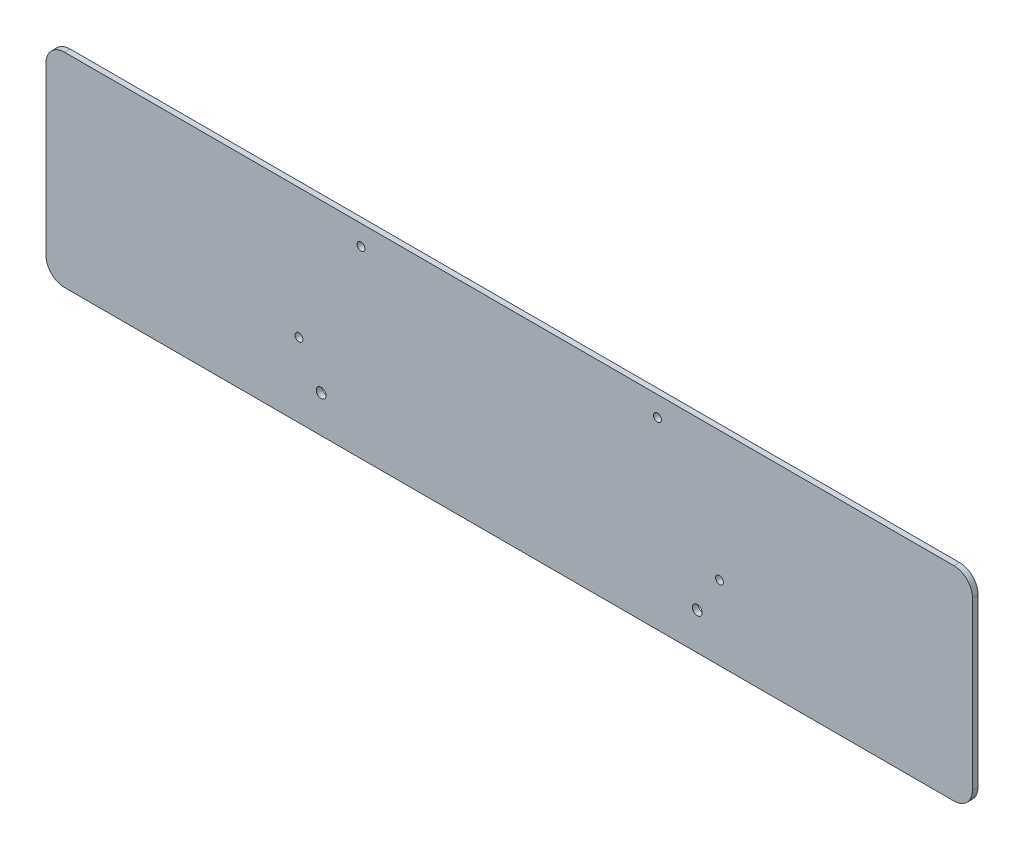
ISO-10303-21;
HEADER;
FILE_DESCRIPTION(('STEP AP214'),'2;1');
FILE_NAME('part.step','',(''),(''),'','','');
FILE_SCHEMA(('AUTOMOTIVE_DESIGN { 1 0 10303 214 1 1 1 1 }'));
ENDSEC;
DATA;
#1=APPLICATION_CONTEXT('core data for automotive mechanical design processes');
#2=APPLICATION_PROTOCOL_DEFINITION('international standard','automotive_design',2000,#1);
#3=PRODUCT_CONTEXT('',#1,'mechanical');
#4=PRODUCT('Part','Part','',(#3));
#5=PRODUCT_RELATED_PRODUCT_CATEGORY('part','',(#4));
#6=PRODUCT_DEFINITION_FORMATION('','',#4);
#7=PRODUCT_DEFINITION_CONTEXT('part definition',#1,'design');
#8=PRODUCT_DEFINITION('design','',#6,#7);
#9=PRODUCT_DEFINITION_SHAPE('','',#8);
#10=(LENGTH_UNIT() NAMED_UNIT(*) SI_UNIT(.MILLI.,.METRE.));
#11=(NAMED_UNIT(*) PLANE_ANGLE_UNIT() SI_UNIT($,.RADIAN.));
#12=(NAMED_UNIT(*) SI_UNIT($,.STERADIAN.) SOLID_ANGLE_UNIT());
#13=UNCERTAINTY_MEASURE_WITH_UNIT(LENGTH_MEASURE(1.E-05),#10,'distance_accuracy_value','');
#14=(GEOMETRIC_REPRESENTATION_CONTEXT(3) GLOBAL_UNCERTAINTY_ASSIGNED_CONTEXT((#13)) GLOBAL_UNIT_ASSIGNED_CONTEXT((#10,
#11,#12)) REPRESENTATION_CONTEXT('',''));
#15=CARTESIAN_POINT('',(0.,0.,0.));
#16=DIRECTION('',(0.,0.,1.));
#17=DIRECTION('',(1.,0.,0.));
#18=AXIS2_PLACEMENT_3D('',#15,#16,#17);
#19=CARTESIAN_POINT('',(0.,0.,3.));
#20=DIRECTION('',(1.,0.,0.));
#21=DIRECTION('',(0.,0.,-1.));
#22=AXIS2_PLACEMENT_3D('',#19,#20,#21);
#23=PLANE('',#22);
#24=DIRECTION('',(0.,-1.,0.));
#25=VECTOR('',#24,1.);
#26=CARTESIAN_POINT('',(0.,0.,0.));
#27=LINE('',#26,#25);
#28=CARTESIAN_POINT('',(0.,100.,0.));
#29=VERTEX_POINT('',#28);
#30=CARTESIAN_POINT('',(0.,10.,0.));
#31=VERTEX_POINT('',#30);
#32=EDGE_CURVE('E143',#29,#31,#27,.T.);
#33=ORIENTED_EDGE('',*,*,#32,.T.);
#34=DIRECTION('',(0.,0.,-1.));
#35=VECTOR('',#34,1.);
#36=CARTESIAN_POINT('',(0.,10.,3.));
#37=LINE('',#36,#35);
#38=CARTESIAN_POINT('',(0.,10.,3.));
#39=VERTEX_POINT('',#38);
#40=EDGE_CURVE('E117',#31,#39,#37,.F.);
#41=ORIENTED_EDGE('',*,*,#40,.T.);
#42=DIRECTION('',(0.,-1.,0.));
#43=VECTOR('',#42,1.);
#44=CARTESIAN_POINT('',(0.,0.,3.));
#45=LINE('',#44,#43);
#46=CARTESIAN_POINT('',(0.,100.,3.));
#47=VERTEX_POINT('',#46);
#48=EDGE_CURVE('E156',#47,#39,#45,.T.);
#49=ORIENTED_EDGE('',*,*,#48,.F.);
#50=DIRECTION('',(0.,0.,-1.));
#51=VECTOR('',#50,1.);
#52=CARTESIAN_POINT('',(0.,100.,3.));
#53=LINE('',#52,#51);
#54=EDGE_CURVE('E123',#47,#29,#53,.T.);
#55=ORIENTED_EDGE('',*,*,#54,.T.);
#56=EDGE_LOOP('',(#33,#41,#49,#55));
#57=FACE_BOUND('',#56,.T.);
#58=ADVANCED_FACE('F44',(#57),#23,.F.);
#59=CARTESIAN_POINT('',(0.,0.,3.));
#60=DIRECTION('',(0.,1.,0.));
#61=DIRECTION('',(0.,0.,1.));
#62=AXIS2_PLACEMENT_3D('',#59,#60,#61);
#63=PLANE('',#62);
#64=DIRECTION('',(1.,0.,0.));
#65=VECTOR('',#64,1.);
#66=CARTESIAN_POINT('',(0.,0.,3.));
#67=LINE('',#66,#65);
#68=CARTESIAN_POINT('',(10.,0.,3.));
#69=VERTEX_POINT('',#68);
#70=CARTESIAN_POINT('',(490.,0.,3.));
#71=VERTEX_POINT('',#70);
#72=EDGE_CURVE('E133',#69,#71,#67,.T.);
#73=ORIENTED_EDGE('',*,*,#72,.F.);
#74=DIRECTION('',(0.,0.,-1.));
#75=VECTOR('',#74,1.);
#76=CARTESIAN_POINT('',(10.,0.,3.));
#77=LINE('',#76,#75);
#78=CARTESIAN_POINT('',(10.,0.,0.));
#79=VERTEX_POINT('',#78);
#80=EDGE_CURVE('E116',#69,#79,#77,.T.);
#81=ORIENTED_EDGE('',*,*,#80,.T.);
#82=DIRECTION('',(1.,0.,0.));
#83=VECTOR('',#82,1.);
#84=CARTESIAN_POINT('',(0.,0.,0.));
#85=LINE('',#84,#83);
#86=CARTESIAN_POINT('',(490.,0.,0.));
#87=VERTEX_POINT('',#86);
#88=EDGE_CURVE('E130',#79,#87,#85,.T.);
#89=ORIENTED_EDGE('',*,*,#88,.T.);
#90=DIRECTION('',(0.,0.,-1.));
#91=VECTOR('',#90,1.);
#92=CARTESIAN_POINT('',(490.,0.,3.));
#93=LINE('',#92,#91);
#94=EDGE_CURVE('E136',#87,#71,#93,.F.);
#95=ORIENTED_EDGE('',*,*,#94,.T.);
#96=EDGE_LOOP('',(#73,#81,#89,#95));
#97=FACE_BOUND('',#96,.T.);
#98=ADVANCED_FACE('F129',(#97),#63,.F.);
#99=CARTESIAN_POINT('',(500.,0.,3.));
#100=DIRECTION('',(-1.,0.,0.));
#101=DIRECTION('',(0.,0.,1.));
#102=AXIS2_PLACEMENT_3D('',#99,#100,#101);
#103=PLANE('',#102);
#104=DIRECTION('',(0.,1.,0.));
#105=VECTOR('',#104,1.);
#106=CARTESIAN_POINT('',(500.,0.,3.));
#107=LINE('',#106,#105);
#108=CARTESIAN_POINT('',(500.,10.,3.));
#109=VERTEX_POINT('',#108);
#110=CARTESIAN_POINT('',(500.,100.,3.));
#111=VERTEX_POINT('',#110);
#112=EDGE_CURVE('E218',#109,#111,#107,.T.);
#113=ORIENTED_EDGE('',*,*,#112,.F.);
#114=DIRECTION('',(0.,0.,-1.));
#115=VECTOR('',#114,1.);
#116=CARTESIAN_POINT('',(500.,10.,3.));
#117=LINE('',#116,#115);
#118=CARTESIAN_POINT('',(500.,10.,0.));
#119=VERTEX_POINT('',#118);
#120=EDGE_CURVE('E11',#109,#119,#117,.T.);
#121=ORIENTED_EDGE('',*,*,#120,.T.);
#122=DIRECTION('',(0.,1.,0.));
#123=VECTOR('',#122,1.);
#124=CARTESIAN_POINT('',(500.,0.,0.));
#125=LINE('',#124,#123);
#126=CARTESIAN_POINT('',(500.,100.,0.));
#127=VERTEX_POINT('',#126);
#128=EDGE_CURVE('E142',#119,#127,#125,.T.);
#129=ORIENTED_EDGE('',*,*,#128,.T.);
#130=DIRECTION('',(0.,0.,-1.));
#131=VECTOR('',#130,1.);
#132=CARTESIAN_POINT('',(500.,100.,3.));
#133=LINE('',#132,#131);
#134=EDGE_CURVE('E53',#127,#111,#133,.F.);
#135=ORIENTED_EDGE('',*,*,#134,.T.);
#136=EDGE_LOOP('',(#113,#121,#129,#135));
#137=FACE_BOUND('',#136,.T.);
#138=ADVANCED_FACE('F217',(#137),#103,.F.);
#139=CARTESIAN_POINT('',(0.,110.,3.));
#140=DIRECTION('',(0.,-1.,0.));
#141=DIRECTION('',(0.,0.,-1.));
#142=AXIS2_PLACEMENT_3D('',#139,#140,#141);
#143=PLANE('',#142);
#144=DIRECTION('',(-1.,0.,0.));
#145=VECTOR('',#144,1.);
#146=CARTESIAN_POINT('',(0.,110.,0.));
#147=LINE('',#146,#145);
#148=CARTESIAN_POINT('',(490.,110.,0.));
#149=VERTEX_POINT('',#148);
#150=CARTESIAN_POINT('',(10.,110.,0.));
#151=VERTEX_POINT('',#150);
#152=EDGE_CURVE('E148',#149,#151,#147,.T.);
#153=ORIENTED_EDGE('',*,*,#152,.T.);
#154=DIRECTION('',(0.,0.,-1.));
#155=VECTOR('',#154,1.);
#156=CARTESIAN_POINT('',(10.,110.,3.));
#157=LINE('',#156,#155);
#158=CARTESIAN_POINT('',(10.,110.,3.));
#159=VERTEX_POINT('',#158);
#160=EDGE_CURVE('E60',#151,#159,#157,.F.);
#161=ORIENTED_EDGE('',*,*,#160,.T.);
#162=DIRECTION('',(-1.,0.,0.));
#163=VECTOR('',#162,1.);
#164=CARTESIAN_POINT('',(0.,110.,3.));
#165=LINE('',#164,#163);
#166=CARTESIAN_POINT('',(490.,110.,3.));
#167=VERTEX_POINT('',#166);
#168=EDGE_CURVE('E184',#167,#159,#165,.T.);
#169=ORIENTED_EDGE('',*,*,#168,.F.);
#170=DIRECTION('',(0.,0.,-1.));
#171=VECTOR('',#170,1.);
#172=CARTESIAN_POINT('',(490.,110.,3.));
#173=LINE('',#172,#171);
#174=EDGE_CURVE('E208',#167,#149,#173,.T.);
#175=ORIENTED_EDGE('',*,*,#174,.T.);
#176=EDGE_LOOP('',(#153,#161,#169,#175));
#177=FACE_BOUND('',#176,.T.);
#178=ADVANCED_FACE('F228',(#177),#143,.F.);
#179=CARTESIAN_POINT('',(0.,0.,3.));
#180=DIRECTION('',(0.,0.,-1.));
#181=DIRECTION('',(-1.,0.,0.));
#182=AXIS2_PLACEMENT_3D('',#179,#180,#181);
#183=PLANE('',#182);
#184=CARTESIAN_POINT('',(170.,99.2,3.));
#185=DIRECTION('',(0.,0.,1.));
#186=DIRECTION('',(1.,0.,0.));
#187=AXIS2_PLACEMENT_3D('',#184,#185,#186);
#188=CIRCLE('',#187,2.12499999999998);
#189=CARTESIAN_POINT('',(172.125,99.2,3.));
#190=VERTEX_POINT('',#189);
#191=EDGE_CURVE('E178',#190,#190,#188,.T.);
#192=ORIENTED_EDGE('',*,*,#191,.F.);
#193=EDGE_LOOP('',(#192));
#194=FACE_BOUND('',#193,.T.);
#195=CARTESIAN_POINT('',(330.,99.2,3.));
#196=DIRECTION('',(0.,0.,1.));
#197=DIRECTION('',(-1.,0.,0.));
#198=AXIS2_PLACEMENT_3D('',#195,#196,#197);
#199=CIRCLE('',#198,2.12499999999995);
#200=CARTESIAN_POINT('',(327.875,99.2,3.));
#201=VERTEX_POINT('',#200);
#202=EDGE_CURVE('E255',#201,#201,#199,.T.);
#203=ORIENTED_EDGE('',*,*,#202,.F.);
#204=EDGE_LOOP('',(#203));
#205=FACE_BOUND('',#204,.T.);
#206=CARTESIAN_POINT('',(351.5,20.,3.));
#207=DIRECTION('',(0.,0.,1.));
#208=DIRECTION('',(-1.,0.,0.));
#209=AXIS2_PLACEMENT_3D('',#206,#207,#208);
#210=CIRCLE('',#209,2.65000000000004);
#211=CARTESIAN_POINT('',(348.85,20.,3.));
#212=VERTEX_POINT('',#211);
#213=EDGE_CURVE('E182',#212,#212,#210,.T.);
#214=ORIENTED_EDGE('',*,*,#213,.F.);
#215=EDGE_LOOP('',(#214));
#216=FACE_BOUND('',#215,.T.);
#217=CARTESIAN_POINT('',(363.5,40.,3.));
#218=DIRECTION('',(0.,0.,1.));
#219=DIRECTION('',(-1.,0.,0.));
#220=AXIS2_PLACEMENT_3D('',#217,#218,#219);
#221=CIRCLE('',#220,2.12499999999995);
#222=CARTESIAN_POINT('',(361.375,40.,3.));
#223=VERTEX_POINT('',#222);
#224=EDGE_CURVE('E248',#223,#223,#221,.T.);
#225=ORIENTED_EDGE('',*,*,#224,.F.);
#226=EDGE_LOOP('',(#225));
#227=FACE_BOUND('',#226,.T.);
#228=CARTESIAN_POINT('',(136.5,40.,3.));
#229=DIRECTION('',(0.,0.,1.));
#230=DIRECTION('',(1.,0.,0.));
#231=AXIS2_PLACEMENT_3D('',#228,#229,#230);
#232=CIRCLE('',#231,2.12499999999997);
#233=CARTESIAN_POINT('',(138.625,40.,3.));
#234=VERTEX_POINT('',#233);
#235=EDGE_CURVE('E244',#234,#234,#232,.T.);
#236=ORIENTED_EDGE('',*,*,#235,.F.);
#237=EDGE_LOOP('',(#236));
#238=FACE_BOUND('',#237,.T.);
#239=CARTESIAN_POINT('',(148.5,20.,3.));
#240=DIRECTION('',(0.,0.,1.));
#241=DIRECTION('',(1.,0.,0.));
#242=AXIS2_PLACEMENT_3D('',#239,#240,#241);
#243=CIRCLE('',#242,2.65000000000001);
#244=CARTESIAN_POINT('',(151.15,20.,3.));
#245=VERTEX_POINT('',#244);
#246=EDGE_CURVE('E162',#245,#245,#243,.T.);
#247=ORIENTED_EDGE('',*,*,#246,.F.);
#248=EDGE_LOOP('',(#247));
#249=FACE_BOUND('',#248,.T.);
#250=ORIENTED_EDGE('',*,*,#48,.T.);
#251=CARTESIAN_POINT('',(10.,10.,3.));
#252=DIRECTION('',(0.,0.,-1.));
#253=DIRECTION('',(-1.,0.,0.));
#254=AXIS2_PLACEMENT_3D('',#251,#252,#253);
#255=CIRCLE('',#254,10.);
#256=EDGE_CURVE('E205',#39,#69,#255,.F.);
#257=ORIENTED_EDGE('',*,*,#256,.T.);
#258=ORIENTED_EDGE('',*,*,#72,.T.);
#259=CARTESIAN_POINT('',(490.,10.,3.));
#260=DIRECTION('',(0.,0.,-1.));
#261=DIRECTION('',(-1.,0.,0.));
#262=AXIS2_PLACEMENT_3D('',#259,#260,#261);
#263=CIRCLE('',#262,10.);
#264=EDGE_CURVE('E199',#71,#109,#263,.F.);
#265=ORIENTED_EDGE('',*,*,#264,.T.);
#266=ORIENTED_EDGE('',*,*,#112,.T.);
#267=CARTESIAN_POINT('',(490.,100.,3.));
#268=DIRECTION('',(0.,0.,-1.));
#269=DIRECTION('',(-1.,0.,0.));
#270=AXIS2_PLACEMENT_3D('',#267,#268,#269);
#271=CIRCLE('',#270,10.);
#272=EDGE_CURVE('E67',#111,#167,#271,.F.);
#273=ORIENTED_EDGE('',*,*,#272,.T.);
#274=ORIENTED_EDGE('',*,*,#168,.T.);
#275=CARTESIAN_POINT('',(10.,100.,3.));
#276=DIRECTION('',(0.,0.,-1.));
#277=DIRECTION('',(-1.,0.,0.));
#278=AXIS2_PLACEMENT_3D('',#275,#276,#277);
#279=CIRCLE('',#278,10.);
#280=EDGE_CURVE('E202',#159,#47,#279,.F.);
#281=ORIENTED_EDGE('',*,*,#280,.T.);
#282=EDGE_LOOP('',(#250,#257,#258,#265,#266,#273,#274,#281));
#283=FACE_BOUND('',#282,.T.);
#284=ADVANCED_FACE('F222',(#194,#205,#216,#227,#238,#249,#283),#183,.F.);
#285=CARTESIAN_POINT('',(0.,0.,0.));
#286=DIRECTION('',(0.,0.,-1.));
#287=DIRECTION('',(-1.,0.,0.));
#288=AXIS2_PLACEMENT_3D('',#285,#286,#287);
#289=PLANE('',#288);
#290=CARTESIAN_POINT('',(170.,99.2,0.));
#291=DIRECTION('',(0.,0.,-1.));
#292=DIRECTION('',(-1.,0.,0.));
#293=AXIS2_PLACEMENT_3D('',#290,#291,#292);
#294=CIRCLE('',#293,2.12499999999998);
#295=CARTESIAN_POINT('',(167.875,99.2,0.));
#296=VERTEX_POINT('',#295);
#297=EDGE_CURVE('E177',#296,#296,#294,.T.);
#298=ORIENTED_EDGE('',*,*,#297,.F.);
#299=EDGE_LOOP('',(#298));
#300=FACE_BOUND('',#299,.T.);
#301=CARTESIAN_POINT('',(330.,99.2,0.));
#302=DIRECTION('',(0.,0.,-1.));
#303=DIRECTION('',(-1.,0.,0.));
#304=AXIS2_PLACEMENT_3D('',#301,#302,#303);
#305=CIRCLE('',#304,2.12499999999995);
#306=CARTESIAN_POINT('',(327.875,99.2,0.));
#307=VERTEX_POINT('',#306);
#308=EDGE_CURVE('E173',#307,#307,#305,.T.);
#309=ORIENTED_EDGE('',*,*,#308,.F.);
#310=EDGE_LOOP('',(#309));
#311=FACE_BOUND('',#310,.T.);
#312=CARTESIAN_POINT('',(351.5,20.,0.));
#313=DIRECTION('',(0.,0.,-1.));
#314=DIRECTION('',(-1.,0.,0.));
#315=AXIS2_PLACEMENT_3D('',#312,#313,#314);
#316=CIRCLE('',#315,2.65000000000004);
#317=CARTESIAN_POINT('',(348.85,20.,0.));
#318=VERTEX_POINT('',#317);
#319=EDGE_CURVE('E150',#318,#318,#316,.T.);
#320=ORIENTED_EDGE('',*,*,#319,.F.);
#321=EDGE_LOOP('',(#320));
#322=FACE_BOUND('',#321,.T.);
#323=CARTESIAN_POINT('',(363.5,40.,0.));
#324=DIRECTION('',(0.,0.,-1.));
#325=DIRECTION('',(-1.,0.,0.));
#326=AXIS2_PLACEMENT_3D('',#323,#324,#325);
#327=CIRCLE('',#326,2.12499999999995);
#328=CARTESIAN_POINT('',(361.375,40.,0.));
#329=VERTEX_POINT('',#328);
#330=EDGE_CURVE('E166',#329,#329,#327,.T.);
#331=ORIENTED_EDGE('',*,*,#330,.F.);
#332=EDGE_LOOP('',(#331));
#333=FACE_BOUND('',#332,.T.);
#334=CARTESIAN_POINT('',(136.5,40.,0.));
#335=DIRECTION('',(0.,0.,-1.));
#336=DIRECTION('',(-1.,0.,0.));
#337=AXIS2_PLACEMENT_3D('',#334,#335,#336);
#338=CIRCLE('',#337,2.12499999999997);
#339=CARTESIAN_POINT('',(134.375,40.,0.));
#340=VERTEX_POINT('',#339);
#341=EDGE_CURVE('E161',#340,#340,#338,.T.);
#342=ORIENTED_EDGE('',*,*,#341,.F.);
#343=EDGE_LOOP('',(#342));
#344=FACE_BOUND('',#343,.T.);
#345=CARTESIAN_POINT('',(148.5,20.,0.));
#346=DIRECTION('',(0.,0.,-1.));
#347=DIRECTION('',(-1.,0.,0.));
#348=AXIS2_PLACEMENT_3D('',#345,#346,#347);
#349=CIRCLE('',#348,2.65000000000001);
#350=CARTESIAN_POINT('',(145.85,20.,0.));
#351=VERTEX_POINT('',#350);
#352=EDGE_CURVE('E157',#351,#351,#349,.T.);
#353=ORIENTED_EDGE('',*,*,#352,.F.);
#354=EDGE_LOOP('',(#353));
#355=FACE_BOUND('',#354,.T.);
#356=ORIENTED_EDGE('',*,*,#88,.F.);
#357=CARTESIAN_POINT('',(10.,10.,0.));
#358=DIRECTION('',(0.,0.,-1.));
#359=DIRECTION('',(-1.,0.,0.));
#360=AXIS2_PLACEMENT_3D('',#357,#358,#359);
#361=CIRCLE('',#360,10.);
#362=EDGE_CURVE('E112',#79,#31,#361,.T.);
#363=ORIENTED_EDGE('',*,*,#362,.T.);
#364=ORIENTED_EDGE('',*,*,#32,.F.);
#365=CARTESIAN_POINT('',(10.,100.,0.));
#366=DIRECTION('',(0.,0.,-1.));
#367=DIRECTION('',(-1.,0.,0.));
#368=AXIS2_PLACEMENT_3D('',#365,#366,#367);
#369=CIRCLE('',#368,10.);
#370=EDGE_CURVE('E124',#29,#151,#369,.T.);
#371=ORIENTED_EDGE('',*,*,#370,.T.);
#372=ORIENTED_EDGE('',*,*,#152,.F.);
#373=CARTESIAN_POINT('',(490.,100.,0.));
#374=DIRECTION('',(0.,0.,-1.));
#375=DIRECTION('',(-1.,0.,0.));
#376=AXIS2_PLACEMENT_3D('',#373,#374,#375);
#377=CIRCLE('',#376,10.);
#378=EDGE_CURVE('E135',#149,#127,#377,.T.);
#379=ORIENTED_EDGE('',*,*,#378,.T.);
#380=ORIENTED_EDGE('',*,*,#128,.F.);
#381=CARTESIAN_POINT('',(490.,10.,0.));
#382=DIRECTION('',(0.,0.,-1.));
#383=DIRECTION('',(-1.,0.,0.));
#384=AXIS2_PLACEMENT_3D('',#381,#382,#383);
#385=CIRCLE('',#384,10.);
#386=EDGE_CURVE('E140',#119,#87,#385,.T.);
#387=ORIENTED_EDGE('',*,*,#386,.T.);
#388=EDGE_LOOP('',(#356,#363,#364,#371,#372,#379,#380,#387));
#389=FACE_BOUND('',#388,.T.);
#390=ADVANCED_FACE('F138',(#300,#311,#322,#333,#344,#355,#389),#289,.T.);
#391=CARTESIAN_POINT('',(148.5,20.,-7.));
#392=DIRECTION('',(0.,0.,1.));
#393=DIRECTION('',(1.,0.,0.));
#394=AXIS2_PLACEMENT_3D('',#391,#392,#393);
#395=CYLINDRICAL_SURFACE('',#394,2.65000000000001);
#396=ORIENTED_EDGE('',*,*,#352,.T.);
#397=EDGE_LOOP('',(#396));
#398=FACE_BOUND('',#397,.T.);
#399=ORIENTED_EDGE('',*,*,#246,.T.);
#400=EDGE_LOOP('',(#399));
#401=FACE_BOUND('',#400,.T.);
#402=ADVANCED_FACE('F278',(#398,#401),#395,.F.);
#403=CARTESIAN_POINT('',(136.5,40.,-7.));
#404=DIRECTION('',(0.,0.,1.));
#405=DIRECTION('',(1.,0.,0.));
#406=AXIS2_PLACEMENT_3D('',#403,#404,#405);
#407=CYLINDRICAL_SURFACE('',#406,2.12499999999997);
#408=ORIENTED_EDGE('',*,*,#341,.T.);
#409=EDGE_LOOP('',(#408));
#410=FACE_BOUND('',#409,.T.);
#411=ORIENTED_EDGE('',*,*,#235,.T.);
#412=EDGE_LOOP('',(#411));
#413=FACE_BOUND('',#412,.T.);
#414=ADVANCED_FACE('F280',(#410,#413),#407,.F.);
#415=CARTESIAN_POINT('',(363.5,40.,-7.));
#416=DIRECTION('',(0.,0.,1.));
#417=DIRECTION('',(1.,0.,0.));
#418=AXIS2_PLACEMENT_3D('',#415,#416,#417);
#419=CYLINDRICAL_SURFACE('',#418,2.12499999999995);
#420=ORIENTED_EDGE('',*,*,#330,.T.);
#421=EDGE_LOOP('',(#420));
#422=FACE_BOUND('',#421,.T.);
#423=ORIENTED_EDGE('',*,*,#224,.T.);
#424=EDGE_LOOP('',(#423));
#425=FACE_BOUND('',#424,.T.);
#426=ADVANCED_FACE('F286',(#422,#425),#419,.F.);
#427=CARTESIAN_POINT('',(351.5,20.,-7.));
#428=DIRECTION('',(0.,0.,1.));
#429=DIRECTION('',(1.,0.,0.));
#430=AXIS2_PLACEMENT_3D('',#427,#428,#429);
#431=CYLINDRICAL_SURFACE('',#430,2.65000000000004);
#432=ORIENTED_EDGE('',*,*,#319,.T.);
#433=EDGE_LOOP('',(#432));
#434=FACE_BOUND('',#433,.T.);
#435=ORIENTED_EDGE('',*,*,#213,.T.);
#436=EDGE_LOOP('',(#435));
#437=FACE_BOUND('',#436,.T.);
#438=ADVANCED_FACE('F348',(#434,#437),#431,.F.);
#439=CARTESIAN_POINT('',(330.,99.2,-7.));
#440=DIRECTION('',(0.,0.,1.));
#441=DIRECTION('',(1.,0.,0.));
#442=AXIS2_PLACEMENT_3D('',#439,#440,#441);
#443=CYLINDRICAL_SURFACE('',#442,2.12499999999995);
#444=ORIENTED_EDGE('',*,*,#308,.T.);
#445=EDGE_LOOP('',(#444));
#446=FACE_BOUND('',#445,.T.);
#447=ORIENTED_EDGE('',*,*,#202,.T.);
#448=EDGE_LOOP('',(#447));
#449=FACE_BOUND('',#448,.T.);
#450=ADVANCED_FACE('F338',(#446,#449),#443,.F.);
#451=CARTESIAN_POINT('',(170.,99.2,-7.));
#452=DIRECTION('',(0.,0.,1.));
#453=DIRECTION('',(1.,0.,0.));
#454=AXIS2_PLACEMENT_3D('',#451,#452,#453);
#455=CYLINDRICAL_SURFACE('',#454,2.12499999999998);
#456=ORIENTED_EDGE('',*,*,#297,.T.);
#457=EDGE_LOOP('',(#456));
#458=FACE_BOUND('',#457,.T.);
#459=ORIENTED_EDGE('',*,*,#191,.T.);
#460=EDGE_LOOP('',(#459));
#461=FACE_BOUND('',#460,.T.);
#462=ADVANCED_FACE('F263',(#458,#461),#455,.F.);
#463=CARTESIAN_POINT('',(10.,10.,3.));
#464=DIRECTION('',(0.,0.,-1.));
#465=DIRECTION('',(-1.,0.,0.));
#466=AXIS2_PLACEMENT_3D('',#463,#464,#465);
#467=CYLINDRICAL_SURFACE('',#466,10.);
#468=ORIENTED_EDGE('',*,*,#256,.F.);
#469=ORIENTED_EDGE('',*,*,#40,.F.);
#470=ORIENTED_EDGE('',*,*,#362,.F.);
#471=ORIENTED_EDGE('',*,*,#80,.F.);
#472=EDGE_LOOP('',(#468,#469,#470,#471));
#473=FACE_BOUND('',#472,.T.);
#474=ADVANCED_FACE('F115',(#473),#467,.T.);
#475=CARTESIAN_POINT('',(10.,100.,3.));
#476=DIRECTION('',(0.,0.,-1.));
#477=DIRECTION('',(-1.,0.,0.));
#478=AXIS2_PLACEMENT_3D('',#475,#476,#477);
#479=CYLINDRICAL_SURFACE('',#478,10.);
#480=ORIENTED_EDGE('',*,*,#280,.F.);
#481=ORIENTED_EDGE('',*,*,#160,.F.);
#482=ORIENTED_EDGE('',*,*,#370,.F.);
#483=ORIENTED_EDGE('',*,*,#54,.F.);
#484=EDGE_LOOP('',(#480,#481,#482,#483));
#485=FACE_BOUND('',#484,.T.);
#486=ADVANCED_FACE('F232',(#485),#479,.T.);
#487=CARTESIAN_POINT('',(490.,10.,3.));
#488=DIRECTION('',(0.,0.,-1.));
#489=DIRECTION('',(-1.,0.,0.));
#490=AXIS2_PLACEMENT_3D('',#487,#488,#489);
#491=CYLINDRICAL_SURFACE('',#490,10.);
#492=ORIENTED_EDGE('',*,*,#264,.F.);
#493=ORIENTED_EDGE('',*,*,#94,.F.);
#494=ORIENTED_EDGE('',*,*,#386,.F.);
#495=ORIENTED_EDGE('',*,*,#120,.F.);
#496=EDGE_LOOP('',(#492,#493,#494,#495));
#497=FACE_BOUND('',#496,.T.);
#498=ADVANCED_FACE('F305',(#497),#491,.T.);
#499=CARTESIAN_POINT('',(490.,100.,3.));
#500=DIRECTION('',(0.,0.,-1.));
#501=DIRECTION('',(-1.,0.,0.));
#502=AXIS2_PLACEMENT_3D('',#499,#500,#501);
#503=CYLINDRICAL_SURFACE('',#502,10.);
#504=ORIENTED_EDGE('',*,*,#272,.F.);
#505=ORIENTED_EDGE('',*,*,#134,.F.);
#506=ORIENTED_EDGE('',*,*,#378,.F.);
#507=ORIENTED_EDGE('',*,*,#174,.F.);
#508=EDGE_LOOP('',(#504,#505,#506,#507));
#509=FACE_BOUND('',#508,.T.);
#510=ADVANCED_FACE('F46',(#509),#503,.T.);
#511=CLOSED_SHELL('',(#58,#98,#138,#178,#284,#390,#402,#414,#426,#438,#450,#462,#474,#486,#498,#510));
#512=MANIFOLD_SOLID_BREP('B2',#511);
#513=ADVANCED_BREP_SHAPE_REPRESENTATION('',(#18,#512),#14);
#514=SHAPE_DEFINITION_REPRESENTATION(#9,#513);
ENDSEC;
END-ISO-10303-21;
